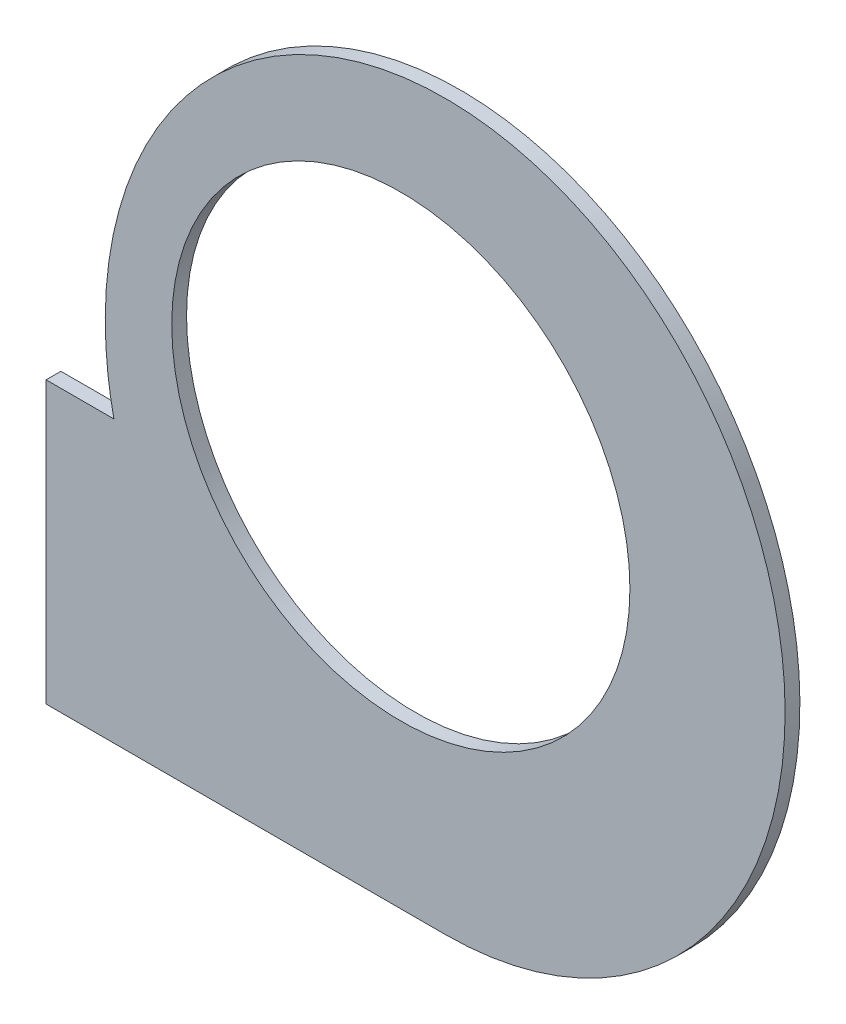
ISO-10303-21;
HEADER;
FILE_DESCRIPTION(('STEP AP214'),'2;1');
FILE_NAME('part.step','',(''),(''),'','','');
FILE_SCHEMA(('AUTOMOTIVE_DESIGN { 1 0 10303 214 1 1 1 1 }'));
ENDSEC;
DATA;
#1=APPLICATION_CONTEXT('core data for automotive mechanical design processes');
#2=APPLICATION_PROTOCOL_DEFINITION('international standard','automotive_design',2000,#1);
#3=PRODUCT_CONTEXT('',#1,'mechanical');
#4=PRODUCT('Part','Part','',(#3));
#5=PRODUCT_RELATED_PRODUCT_CATEGORY('part','',(#4));
#6=PRODUCT_DEFINITION_FORMATION('','',#4);
#7=PRODUCT_DEFINITION_CONTEXT('part definition',#1,'design');
#8=PRODUCT_DEFINITION('design','',#6,#7);
#9=PRODUCT_DEFINITION_SHAPE('','',#8);
#10=(LENGTH_UNIT() NAMED_UNIT(*) SI_UNIT(.MILLI.,.METRE.));
#11=(NAMED_UNIT(*) PLANE_ANGLE_UNIT() SI_UNIT($,.RADIAN.));
#12=(NAMED_UNIT(*) SI_UNIT($,.STERADIAN.) SOLID_ANGLE_UNIT());
#13=UNCERTAINTY_MEASURE_WITH_UNIT(LENGTH_MEASURE(1.E-05),#10,'distance_accuracy_value','');
#14=(GEOMETRIC_REPRESENTATION_CONTEXT(3) GLOBAL_UNCERTAINTY_ASSIGNED_CONTEXT((#13)) GLOBAL_UNIT_ASSIGNED_CONTEXT((#10,
#11,#12)) REPRESENTATION_CONTEXT('',''));
#15=CARTESIAN_POINT('',(0.,0.,0.));
#16=DIRECTION('',(0.,0.,1.));
#17=DIRECTION('',(1.,0.,0.));
#18=AXIS2_PLACEMENT_3D('',#15,#16,#17);
#19=CARTESIAN_POINT('',(0.,0.,1.));
#20=DIRECTION('',(0.,0.,1.));
#21=DIRECTION('',(1.,0.,0.));
#22=AXIS2_PLACEMENT_3D('',#19,#20,#21);
#23=PLANE('',#22);
#24=DIRECTION('',(-1.,0.,0.));
#25=VECTOR('',#24,1.);
#26=CARTESIAN_POINT('',(-27.,-5.50000000000001,1.));
#27=LINE('',#26,#25);
#28=CARTESIAN_POINT('',(-22.4129581130781,-5.5,1.));
#29=VERTEX_POINT('',#28);
#30=CARTESIAN_POINT('',(-27.,-5.50000000000001,1.));
#31=VERTEX_POINT('',#30);
#32=EDGE_CURVE('E85',#29,#31,#27,.T.);
#33=ORIENTED_EDGE('',*,*,#32,.T.);
#34=DIRECTION('',(0.,-1.,0.));
#35=VECTOR('',#34,1.);
#36=CARTESIAN_POINT('',(-27.,-24.5,1.));
#37=LINE('',#36,#35);
#38=CARTESIAN_POINT('',(-27.,-24.5,1.));
#39=VERTEX_POINT('',#38);
#40=EDGE_CURVE('E80',#31,#39,#37,.T.);
#41=ORIENTED_EDGE('',*,*,#40,.T.);
#42=DIRECTION('',(1.,0.,0.));
#43=VECTOR('',#42,1.);
#44=CARTESIAN_POINT('',(0.,-24.5,1.));
#45=LINE('',#44,#43);
#46=CARTESIAN_POINT('',(0.,-24.5,1.));
#47=VERTEX_POINT('',#46);
#48=EDGE_CURVE('E83',#39,#47,#45,.T.);
#49=ORIENTED_EDGE('',*,*,#48,.T.);
#50=CARTESIAN_POINT('',(0.,0.,1.));
#51=DIRECTION('',(0.,0.,1.));
#52=DIRECTION('',(0.,1.,0.));
#53=AXIS2_PLACEMENT_3D('',#50,#51,#52);
#54=ELLIPSE('',#53,24.5,23.);
#55=EDGE_CURVE('E50',#47,#29,#54,.T.);
#56=ORIENTED_EDGE('',*,*,#55,.T.);
#57=EDGE_LOOP('',(#33,#41,#49,#56));
#58=FACE_BOUND('',#57,.T.);
#59=CARTESIAN_POINT('',(-3.,2.,1.));
#60=DIRECTION('',(0.,0.,1.));
#61=DIRECTION('',(1.,0.,0.));
#62=AXIS2_PLACEMENT_3D('',#59,#60,#61);
#63=CIRCLE('',#62,15.5);
#64=CARTESIAN_POINT('',(12.5,2.,1.));
#65=VERTEX_POINT('',#64);
#66=EDGE_CURVE('E127',#65,#65,#63,.T.);
#67=ORIENTED_EDGE('',*,*,#66,.F.);
#68=EDGE_LOOP('',(#67));
#69=FACE_BOUND('',#68,.T.);
#70=ADVANCED_FACE('F33',(#58,#69),#23,.T.);
#71=CARTESIAN_POINT('',(0.,0.,0.));
#72=DIRECTION('',(0.,0.,1.));
#73=DIRECTION('',(1.,0.,0.));
#74=AXIS2_PLACEMENT_3D('',#71,#72,#73);
#75=PLANE('',#74);
#76=DIRECTION('',(-1.,0.,0.));
#77=VECTOR('',#76,1.);
#78=CARTESIAN_POINT('',(-27.,-5.50000000000001,0.));
#79=LINE('',#78,#77);
#80=CARTESIAN_POINT('',(-22.4129581130781,-5.5,0.));
#81=VERTEX_POINT('',#80);
#82=CARTESIAN_POINT('',(-27.,-5.50000000000001,0.));
#83=VERTEX_POINT('',#82);
#84=EDGE_CURVE('E98',#81,#83,#79,.T.);
#85=ORIENTED_EDGE('',*,*,#84,.F.);
#86=CARTESIAN_POINT('',(0.,0.,0.));
#87=DIRECTION('',(0.,0.,1.));
#88=DIRECTION('',(0.,1.,0.));
#89=AXIS2_PLACEMENT_3D('',#86,#87,#88);
#90=ELLIPSE('',#89,24.5,23.);
#91=CARTESIAN_POINT('',(0.,-24.5,0.));
#92=VERTEX_POINT('',#91);
#93=EDGE_CURVE('E73',#92,#81,#90,.T.);
#94=ORIENTED_EDGE('',*,*,#93,.F.);
#95=DIRECTION('',(1.,0.,0.));
#96=VECTOR('',#95,1.);
#97=CARTESIAN_POINT('',(0.,-24.5,0.));
#98=LINE('',#97,#96);
#99=CARTESIAN_POINT('',(-27.,-24.5,0.));
#100=VERTEX_POINT('',#99);
#101=EDGE_CURVE('E67',#100,#92,#98,.T.);
#102=ORIENTED_EDGE('',*,*,#101,.F.);
#103=DIRECTION('',(0.,-1.,0.));
#104=VECTOR('',#103,1.);
#105=CARTESIAN_POINT('',(-27.,-24.5,0.));
#106=LINE('',#105,#104);
#107=EDGE_CURVE('E89',#83,#100,#106,.T.);
#108=ORIENTED_EDGE('',*,*,#107,.F.);
#109=EDGE_LOOP('',(#85,#94,#102,#108));
#110=FACE_BOUND('',#109,.T.);
#111=CARTESIAN_POINT('',(-3.,2.,0.));
#112=DIRECTION('',(0.,0.,1.));
#113=DIRECTION('',(1.,0.,0.));
#114=AXIS2_PLACEMENT_3D('',#111,#112,#113);
#115=CIRCLE('',#114,15.5);
#116=CARTESIAN_POINT('',(12.5,2.,0.));
#117=VERTEX_POINT('',#116);
#118=EDGE_CURVE('E130',#117,#117,#115,.T.);
#119=ORIENTED_EDGE('',*,*,#118,.T.);
#120=EDGE_LOOP('',(#119));
#121=FACE_BOUND('',#120,.T.);
#122=ADVANCED_FACE('F106',(#110,#121),#75,.F.);
#123=CARTESIAN_POINT('',(-27.,-5.50000000000001,1.));
#124=DIRECTION('',(0.,-1.,0.));
#125=DIRECTION('',(1.,0.,0.));
#126=AXIS2_PLACEMENT_3D('',#123,#124,#125);
#127=PLANE('',#126);
#128=ORIENTED_EDGE('',*,*,#84,.T.);
#129=DIRECTION('',(0.,0.,-1.));
#130=VECTOR('',#129,1.);
#131=CARTESIAN_POINT('',(-27.,-5.50000000000001,1.));
#132=LINE('',#131,#130);
#133=EDGE_CURVE('E11',#31,#83,#132,.T.);
#134=ORIENTED_EDGE('',*,*,#133,.F.);
#135=ORIENTED_EDGE('',*,*,#32,.F.);
#136=DIRECTION('',(0.,0.,-1.));
#137=VECTOR('',#136,1.);
#138=CARTESIAN_POINT('',(-22.4129581130781,-5.5,1.));
#139=LINE('',#138,#137);
#140=EDGE_CURVE('E93',#29,#81,#139,.T.);
#141=ORIENTED_EDGE('',*,*,#140,.T.);
#142=EDGE_LOOP('',(#128,#134,#135,#141));
#143=FACE_BOUND('',#142,.T.);
#144=ADVANCED_FACE('F35',(#143),#127,.F.);
#145=CARTESIAN_POINT('',(-27.,-24.5,1.));
#146=DIRECTION('',(1.,0.,0.));
#147=DIRECTION('',(0.,0.,-1.));
#148=AXIS2_PLACEMENT_3D('',#145,#146,#147);
#149=PLANE('',#148);
#150=ORIENTED_EDGE('',*,*,#107,.T.);
#151=DIRECTION('',(0.,0.,-1.));
#152=VECTOR('',#151,1.);
#153=CARTESIAN_POINT('',(-27.,-24.5,1.));
#154=LINE('',#153,#152);
#155=EDGE_CURVE('E42',#39,#100,#154,.T.);
#156=ORIENTED_EDGE('',*,*,#155,.F.);
#157=ORIENTED_EDGE('',*,*,#40,.F.);
#158=ORIENTED_EDGE('',*,*,#133,.T.);
#159=EDGE_LOOP('',(#150,#156,#157,#158));
#160=FACE_BOUND('',#159,.T.);
#161=ADVANCED_FACE('F88',(#160),#149,.F.);
#162=CARTESIAN_POINT('',(0.,-24.5,1.));
#163=DIRECTION('',(0.,1.,0.));
#164=DIRECTION('',(-1.,0.,0.));
#165=AXIS2_PLACEMENT_3D('',#162,#163,#164);
#166=PLANE('',#165);
#167=ORIENTED_EDGE('',*,*,#101,.T.);
#168=DIRECTION('',(0.,0.,-1.));
#169=VECTOR('',#168,1.);
#170=CARTESIAN_POINT('',(0.,-24.5,1.));
#171=LINE('',#170,#169);
#172=EDGE_CURVE('E90',#47,#92,#171,.T.);
#173=ORIENTED_EDGE('',*,*,#172,.F.);
#174=ORIENTED_EDGE('',*,*,#48,.F.);
#175=ORIENTED_EDGE('',*,*,#155,.T.);
#176=EDGE_LOOP('',(#167,#173,#174,#175));
#177=FACE_BOUND('',#176,.T.);
#178=ADVANCED_FACE('F91',(#177),#166,.F.);
#179=DIRECTION('',(0.,0.,-1.));
#180=VECTOR('',#179,1.);
#181=SURFACE_OF_LINEAR_EXTRUSION('',#54,#180);
#182=ORIENTED_EDGE('',*,*,#93,.T.);
#183=ORIENTED_EDGE('',*,*,#140,.F.);
#184=ORIENTED_EDGE('',*,*,#55,.F.);
#185=ORIENTED_EDGE('',*,*,#172,.T.);
#186=EDGE_LOOP('',(#182,#183,#184,#185));
#187=FACE_BOUND('',#186,.T.);
#188=ADVANCED_FACE('F101',(#187),#181,.F.);
#189=CARTESIAN_POINT('',(-3.,2.,1.));
#190=DIRECTION('',(0.,0.,-1.));
#191=DIRECTION('',(-1.,0.,0.));
#192=AXIS2_PLACEMENT_3D('',#189,#190,#191);
#193=CYLINDRICAL_SURFACE('',#192,15.5);
#194=ORIENTED_EDGE('',*,*,#66,.T.);
#195=EDGE_LOOP('',(#194));
#196=FACE_BOUND('',#195,.T.);
#197=ORIENTED_EDGE('',*,*,#118,.F.);
#198=EDGE_LOOP('',(#197));
#199=FACE_BOUND('',#198,.T.);
#200=ADVANCED_FACE('F105',(#196,#199),#193,.F.);
#201=CLOSED_SHELL('',(#70,#122,#144,#161,#178,#188,#200));
#202=MANIFOLD_SOLID_BREP('B2',#201);
#203=ADVANCED_BREP_SHAPE_REPRESENTATION('',(#18,#202),#14);
#204=SHAPE_DEFINITION_REPRESENTATION(#9,#203);
ENDSEC;
END-ISO-10303-21;
